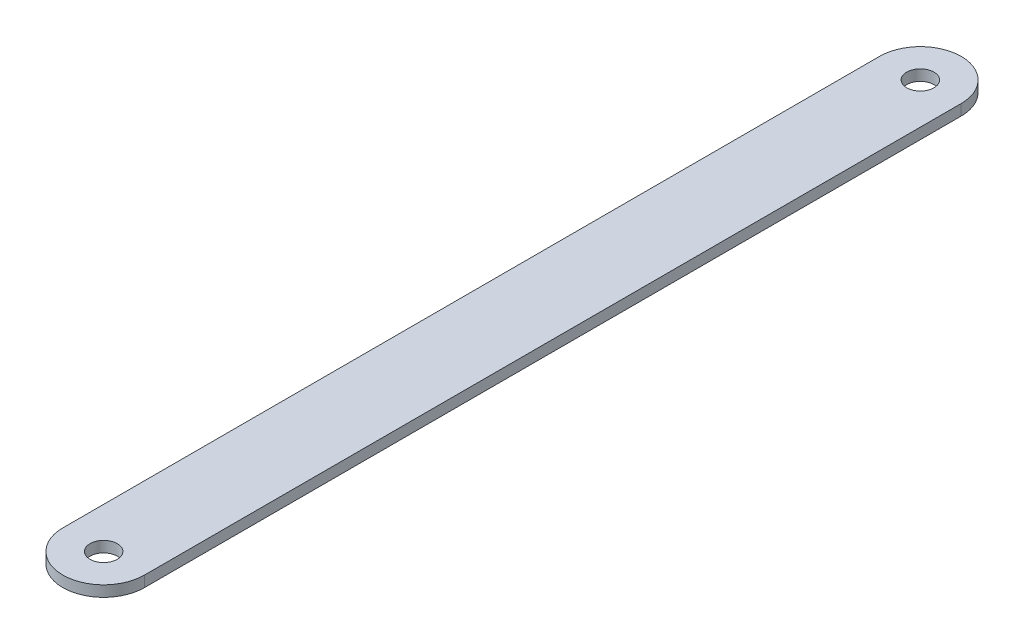
ISO-10303-21;
HEADER;
FILE_DESCRIPTION(('STEP AP214'),'2;1');
FILE_NAME('part.step','',(''),(''),'','','');
FILE_SCHEMA(('AUTOMOTIVE_DESIGN { 1 0 10303 214 1 1 1 1 }'));
ENDSEC;
DATA;
#1=APPLICATION_CONTEXT('core data for automotive mechanical design processes');
#2=APPLICATION_PROTOCOL_DEFINITION('international standard','automotive_design',2000,#1);
#3=PRODUCT_CONTEXT('',#1,'mechanical');
#4=PRODUCT('Part','Part','',(#3));
#5=PRODUCT_RELATED_PRODUCT_CATEGORY('part','',(#4));
#6=PRODUCT_DEFINITION_FORMATION('','',#4);
#7=PRODUCT_DEFINITION_CONTEXT('part definition',#1,'design');
#8=PRODUCT_DEFINITION('design','',#6,#7);
#9=PRODUCT_DEFINITION_SHAPE('','',#8);
#10=(LENGTH_UNIT() NAMED_UNIT(*) SI_UNIT(.MILLI.,.METRE.));
#11=(NAMED_UNIT(*) PLANE_ANGLE_UNIT() SI_UNIT($,.RADIAN.));
#12=(NAMED_UNIT(*) SI_UNIT($,.STERADIAN.) SOLID_ANGLE_UNIT());
#13=UNCERTAINTY_MEASURE_WITH_UNIT(LENGTH_MEASURE(1.E-05),#10,'distance_accuracy_value','');
#14=(GEOMETRIC_REPRESENTATION_CONTEXT(3) GLOBAL_UNCERTAINTY_ASSIGNED_CONTEXT((#13)) GLOBAL_UNIT_ASSIGNED_CONTEXT((#10,
#11,#12)) REPRESENTATION_CONTEXT('',''));
#15=CARTESIAN_POINT('',(0.,0.,0.));
#16=DIRECTION('',(0.,0.,1.));
#17=DIRECTION('',(1.,0.,0.));
#18=AXIS2_PLACEMENT_3D('',#15,#16,#17);
#19=CARTESIAN_POINT('',(-8.15476190476192,1.,-108.511904761905));
#20=DIRECTION('',(0.,-1.,0.));
#21=DIRECTION('',(0.,0.,-1.));
#22=AXIS2_PLACEMENT_3D('',#19,#20,#21);
#23=CYLINDRICAL_SURFACE('',#22,7.5);
#24=CARTESIAN_POINT('',(-8.15476190476192,-1.,-108.511904761905));
#25=DIRECTION('',(0.,1.,0.));
#26=DIRECTION('',(0.,0.,-1.));
#27=AXIS2_PLACEMENT_3D('',#24,#25,#26);
#28=CIRCLE('',#27,7.5);
#29=CARTESIAN_POINT('',(-0.654761904761922,-1.,-108.511904761905));
#30=VERTEX_POINT('',#29);
#31=CARTESIAN_POINT('',(-15.6547619047619,-1.,-108.511904761905));
#32=VERTEX_POINT('',#31);
#33=EDGE_CURVE('E117',#30,#32,#28,.T.);
#34=ORIENTED_EDGE('',*,*,#33,.T.);
#35=DIRECTION('',(0.,-1.,0.));
#36=VECTOR('',#35,1.);
#37=CARTESIAN_POINT('',(-15.6547619047619,1.,-108.511904761905));
#38=LINE('',#37,#36);
#39=CARTESIAN_POINT('',(-15.6547619047619,1.,-108.511904761905));
#40=VERTEX_POINT('',#39);
#41=EDGE_CURVE('E11',#40,#32,#38,.T.);
#42=ORIENTED_EDGE('',*,*,#41,.F.);
#43=CARTESIAN_POINT('',(-8.15476190476192,1.,-108.511904761905));
#44=DIRECTION('',(0.,1.,0.));
#45=DIRECTION('',(0.,0.,-1.));
#46=AXIS2_PLACEMENT_3D('',#43,#44,#45);
#47=CIRCLE('',#46,7.5);
#48=CARTESIAN_POINT('',(-0.654761904761922,1.,-108.511904761905));
#49=VERTEX_POINT('',#48);
#50=EDGE_CURVE('E101',#49,#40,#47,.T.);
#51=ORIENTED_EDGE('',*,*,#50,.F.);
#52=DIRECTION('',(0.,-1.,0.));
#53=VECTOR('',#52,1.);
#54=CARTESIAN_POINT('',(-0.654761904761922,1.,-108.511904761905));
#55=LINE('',#54,#53);
#56=EDGE_CURVE('E113',#49,#30,#55,.T.);
#57=ORIENTED_EDGE('',*,*,#56,.T.);
#58=EDGE_LOOP('',(#34,#42,#51,#57));
#59=FACE_BOUND('',#58,.T.);
#60=ADVANCED_FACE('F49',(#59),#23,.T.);
#61=CARTESIAN_POINT('',(-15.6547619047619,1.,-108.511904761905));
#62=DIRECTION('',(1.,0.,0.));
#63=DIRECTION('',(0.,0.,-1.));
#64=AXIS2_PLACEMENT_3D('',#61,#62,#63);
#65=PLANE('',#64);
#66=DIRECTION('',(0.,0.,1.));
#67=VECTOR('',#66,1.);
#68=CARTESIAN_POINT('',(-15.6547619047619,-1.,-108.511904761905));
#69=LINE('',#68,#67);
#70=CARTESIAN_POINT('',(-15.6547619047619,-1.,41.4880952380952));
#71=VERTEX_POINT('',#70);
#72=EDGE_CURVE('E106',#32,#71,#69,.T.);
#73=ORIENTED_EDGE('',*,*,#72,.T.);
#74=DIRECTION('',(0.,-1.,0.));
#75=VECTOR('',#74,1.);
#76=CARTESIAN_POINT('',(-15.6547619047619,1.,41.4880952380952));
#77=LINE('',#76,#75);
#78=CARTESIAN_POINT('',(-15.6547619047619,1.,41.4880952380952));
#79=VERTEX_POINT('',#78);
#80=EDGE_CURVE('E58',#79,#71,#77,.T.);
#81=ORIENTED_EDGE('',*,*,#80,.F.);
#82=DIRECTION('',(0.,0.,1.));
#83=VECTOR('',#82,1.);
#84=CARTESIAN_POINT('',(-15.6547619047619,1.,-108.511904761905));
#85=LINE('',#84,#83);
#86=EDGE_CURVE('E96',#40,#79,#85,.T.);
#87=ORIENTED_EDGE('',*,*,#86,.F.);
#88=ORIENTED_EDGE('',*,*,#41,.T.);
#89=EDGE_LOOP('',(#73,#81,#87,#88));
#90=FACE_BOUND('',#89,.T.);
#91=ADVANCED_FACE('F105',(#90),#65,.F.);
#92=CARTESIAN_POINT('',(-8.15476190476191,1.,41.4880952380952));
#93=DIRECTION('',(0.,-1.,0.));
#94=DIRECTION('',(0.,0.,-1.));
#95=AXIS2_PLACEMENT_3D('',#92,#93,#94);
#96=CYLINDRICAL_SURFACE('',#95,7.5);
#97=CARTESIAN_POINT('',(-8.15476190476191,-1.,41.4880952380952));
#98=DIRECTION('',(0.,1.,0.));
#99=DIRECTION('',(0.,0.,1.));
#100=AXIS2_PLACEMENT_3D('',#97,#98,#99);
#101=CIRCLE('',#100,7.5);
#102=CARTESIAN_POINT('',(-0.654761904761904,-1.,41.4880952380952));
#103=VERTEX_POINT('',#102);
#104=EDGE_CURVE('E83',#71,#103,#101,.T.);
#105=ORIENTED_EDGE('',*,*,#104,.T.);
#106=DIRECTION('',(0.,-1.,0.));
#107=VECTOR('',#106,1.);
#108=CARTESIAN_POINT('',(-0.654761904761904,1.,41.4880952380952));
#109=LINE('',#108,#107);
#110=CARTESIAN_POINT('',(-0.654761904761904,1.,41.4880952380952));
#111=VERTEX_POINT('',#110);
#112=EDGE_CURVE('E108',#111,#103,#109,.T.);
#113=ORIENTED_EDGE('',*,*,#112,.F.);
#114=CARTESIAN_POINT('',(-8.15476190476191,1.,41.4880952380952));
#115=DIRECTION('',(0.,1.,0.));
#116=DIRECTION('',(0.,0.,1.));
#117=AXIS2_PLACEMENT_3D('',#114,#115,#116);
#118=CIRCLE('',#117,7.5);
#119=EDGE_CURVE('E99',#79,#111,#118,.T.);
#120=ORIENTED_EDGE('',*,*,#119,.F.);
#121=ORIENTED_EDGE('',*,*,#80,.T.);
#122=EDGE_LOOP('',(#105,#113,#120,#121));
#123=FACE_BOUND('',#122,.T.);
#124=ADVANCED_FACE('F109',(#123),#96,.T.);
#125=CARTESIAN_POINT('',(-0.654761904761922,1.,-108.511904761905));
#126=DIRECTION('',(-1.,0.,0.));
#127=DIRECTION('',(0.,0.,1.));
#128=AXIS2_PLACEMENT_3D('',#125,#126,#127);
#129=PLANE('',#128);
#130=DIRECTION('',(0.,0.,-1.));
#131=VECTOR('',#130,1.);
#132=CARTESIAN_POINT('',(-0.654761904761922,-1.,-108.511904761905));
#133=LINE('',#132,#131);
#134=EDGE_CURVE('E89',#103,#30,#133,.T.);
#135=ORIENTED_EDGE('',*,*,#134,.T.);
#136=ORIENTED_EDGE('',*,*,#56,.F.);
#137=DIRECTION('',(0.,0.,-1.));
#138=VECTOR('',#137,1.);
#139=CARTESIAN_POINT('',(-0.654761904761922,1.,-108.511904761905));
#140=LINE('',#139,#138);
#141=EDGE_CURVE('E66',#111,#49,#140,.T.);
#142=ORIENTED_EDGE('',*,*,#141,.F.);
#143=ORIENTED_EDGE('',*,*,#112,.T.);
#144=EDGE_LOOP('',(#135,#136,#142,#143));
#145=FACE_BOUND('',#144,.T.);
#146=ADVANCED_FACE('F131',(#145),#129,.F.);
#147=CARTESIAN_POINT('',(-8.15476190476192,1.,-108.511904761905));
#148=DIRECTION('',(0.,-1.,0.));
#149=DIRECTION('',(0.,0.,-1.));
#150=AXIS2_PLACEMENT_3D('',#147,#148,#149);
#151=PLANE('',#150);
#152=CARTESIAN_POINT('',(-8.15476190476192,1.,-108.511904761905));
#153=DIRECTION('',(0.,1.,0.));
#154=DIRECTION('',(0.,0.,1.));
#155=AXIS2_PLACEMENT_3D('',#152,#153,#154);
#156=CIRCLE('',#155,2.5);
#157=CARTESIAN_POINT('',(-8.15476190476192,1.,-106.011904761905));
#158=VERTEX_POINT('',#157);
#159=EDGE_CURVE('E146',#158,#158,#156,.T.);
#160=ORIENTED_EDGE('',*,*,#159,.F.);
#161=EDGE_LOOP('',(#160));
#162=FACE_BOUND('',#161,.T.);
#163=CARTESIAN_POINT('',(-8.15476190476191,1.,41.4880952380952));
#164=DIRECTION('',(0.,1.,0.));
#165=DIRECTION('',(0.,0.,1.));
#166=AXIS2_PLACEMENT_3D('',#163,#164,#165);
#167=CIRCLE('',#166,2.5);
#168=CARTESIAN_POINT('',(-8.15476190476191,1.,43.9880952380952));
#169=VERTEX_POINT('',#168);
#170=EDGE_CURVE('E142',#169,#169,#167,.T.);
#171=ORIENTED_EDGE('',*,*,#170,.F.);
#172=EDGE_LOOP('',(#171));
#173=FACE_BOUND('',#172,.T.);
#174=ORIENTED_EDGE('',*,*,#50,.T.);
#175=ORIENTED_EDGE('',*,*,#86,.T.);
#176=ORIENTED_EDGE('',*,*,#119,.T.);
#177=ORIENTED_EDGE('',*,*,#141,.T.);
#178=EDGE_LOOP('',(#174,#175,#176,#177));
#179=FACE_BOUND('',#178,.T.);
#180=ADVANCED_FACE('F97',(#162,#173,#179),#151,.F.);
#181=CARTESIAN_POINT('',(-8.15476190476192,-1.,-108.511904761905));
#182=DIRECTION('',(0.,-1.,0.));
#183=DIRECTION('',(0.,0.,-1.));
#184=AXIS2_PLACEMENT_3D('',#181,#182,#183);
#185=PLANE('',#184);
#186=CARTESIAN_POINT('',(-8.15476190476192,-1.,-108.511904761905));
#187=DIRECTION('',(0.,1.,0.));
#188=DIRECTION('',(0.,0.,1.));
#189=AXIS2_PLACEMENT_3D('',#186,#187,#188);
#190=CIRCLE('',#189,2.5);
#191=CARTESIAN_POINT('',(-8.15476190476192,-1.,-106.011904761905));
#192=VERTEX_POINT('',#191);
#193=EDGE_CURVE('E121',#192,#192,#190,.T.);
#194=ORIENTED_EDGE('',*,*,#193,.T.);
#195=EDGE_LOOP('',(#194));
#196=FACE_BOUND('',#195,.T.);
#197=CARTESIAN_POINT('',(-8.15476190476191,-1.,41.4880952380952));
#198=DIRECTION('',(0.,1.,0.));
#199=DIRECTION('',(0.,0.,1.));
#200=AXIS2_PLACEMENT_3D('',#197,#198,#199);
#201=CIRCLE('',#200,2.5);
#202=CARTESIAN_POINT('',(-8.15476190476191,-1.,43.9880952380952));
#203=VERTEX_POINT('',#202);
#204=EDGE_CURVE('E138',#203,#203,#201,.T.);
#205=ORIENTED_EDGE('',*,*,#204,.T.);
#206=EDGE_LOOP('',(#205));
#207=FACE_BOUND('',#206,.T.);
#208=ORIENTED_EDGE('',*,*,#33,.F.);
#209=ORIENTED_EDGE('',*,*,#134,.F.);
#210=ORIENTED_EDGE('',*,*,#104,.F.);
#211=ORIENTED_EDGE('',*,*,#72,.F.);
#212=EDGE_LOOP('',(#208,#209,#210,#211));
#213=FACE_BOUND('',#212,.T.);
#214=ADVANCED_FACE('F134',(#196,#207,#213),#185,.T.);
#215=CARTESIAN_POINT('',(-8.15476190476191,-1.,41.4880952380952));
#216=DIRECTION('',(0.,1.,0.));
#217=DIRECTION('',(0.,0.,1.));
#218=AXIS2_PLACEMENT_3D('',#215,#216,#217);
#219=CYLINDRICAL_SURFACE('',#218,2.5);
#220=ORIENTED_EDGE('',*,*,#204,.F.);
#221=EDGE_LOOP('',(#220));
#222=FACE_BOUND('',#221,.T.);
#223=ORIENTED_EDGE('',*,*,#170,.T.);
#224=EDGE_LOOP('',(#223));
#225=FACE_BOUND('',#224,.T.);
#226=ADVANCED_FACE('F159',(#222,#225),#219,.F.);
#227=CARTESIAN_POINT('',(-8.15476190476192,-1.,-108.511904761905));
#228=DIRECTION('',(0.,1.,0.));
#229=DIRECTION('',(0.,0.,1.));
#230=AXIS2_PLACEMENT_3D('',#227,#228,#229);
#231=CYLINDRICAL_SURFACE('',#230,2.5);
#232=ORIENTED_EDGE('',*,*,#193,.F.);
#233=EDGE_LOOP('',(#232));
#234=FACE_BOUND('',#233,.T.);
#235=ORIENTED_EDGE('',*,*,#159,.T.);
#236=EDGE_LOOP('',(#235));
#237=FACE_BOUND('',#236,.T.);
#238=ADVANCED_FACE('F156',(#234,#237),#231,.F.);
#239=CLOSED_SHELL('',(#60,#91,#124,#146,#180,#214,#226,#238));
#240=MANIFOLD_SOLID_BREP('B2',#239);
#241=ADVANCED_BREP_SHAPE_REPRESENTATION('',(#18,#240),#14);
#242=SHAPE_DEFINITION_REPRESENTATION(#9,#241);
ENDSEC;
END-ISO-10303-21;
